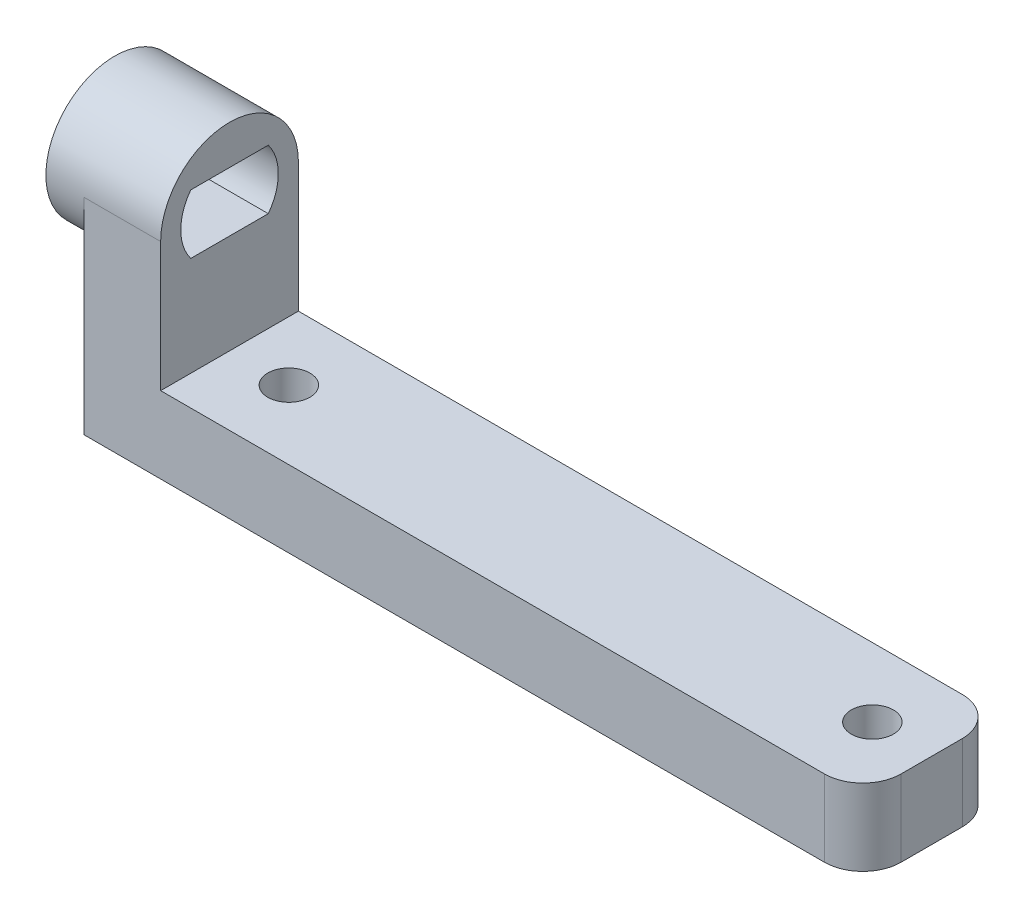
ISO-10303-21;
HEADER;
FILE_DESCRIPTION(('STEP AP214'),'2;1');
FILE_NAME('part.step','',(''),(''),'','','');
FILE_SCHEMA(('AUTOMOTIVE_DESIGN { 1 0 10303 214 1 1 1 1 }'));
ENDSEC;
DATA;
#1=APPLICATION_CONTEXT('core data for automotive mechanical design processes');
#2=APPLICATION_PROTOCOL_DEFINITION('international standard','automotive_design',2000,#1);
#3=PRODUCT_CONTEXT('',#1,'mechanical');
#4=PRODUCT('Part','Part','',(#3));
#5=PRODUCT_RELATED_PRODUCT_CATEGORY('part','',(#4));
#6=PRODUCT_DEFINITION_FORMATION('','',#4);
#7=PRODUCT_DEFINITION_CONTEXT('part definition',#1,'design');
#8=PRODUCT_DEFINITION('design','',#6,#7);
#9=PRODUCT_DEFINITION_SHAPE('','',#8);
#10=(LENGTH_UNIT() NAMED_UNIT(*) SI_UNIT(.MILLI.,.METRE.));
#11=(NAMED_UNIT(*) PLANE_ANGLE_UNIT() SI_UNIT($,.RADIAN.));
#12=(NAMED_UNIT(*) SI_UNIT($,.STERADIAN.) SOLID_ANGLE_UNIT());
#13=UNCERTAINTY_MEASURE_WITH_UNIT(LENGTH_MEASURE(1.E-05),#10,'distance_accuracy_value','');
#14=(GEOMETRIC_REPRESENTATION_CONTEXT(3) GLOBAL_UNCERTAINTY_ASSIGNED_CONTEXT((#13)) GLOBAL_UNIT_ASSIGNED_CONTEXT((#10,
#11,#12)) REPRESENTATION_CONTEXT('',''));
#15=CARTESIAN_POINT('',(0.,0.,0.));
#16=DIRECTION('',(0.,0.,1.));
#17=DIRECTION('',(1.,0.,0.));
#18=AXIS2_PLACEMENT_3D('',#15,#16,#17);
#19=CARTESIAN_POINT('',(0.,4.,3.6));
#20=DIRECTION('',(0.,0.,1.));
#21=DIRECTION('',(1.,0.,0.));
#22=AXIS2_PLACEMENT_3D('',#19,#20,#21);
#23=PLANE('',#22);
#24=DIRECTION('',(-1.,0.,0.));
#25=VECTOR('',#24,1.);
#26=CARTESIAN_POINT('',(0.,0.,3.6));
#27=LINE('',#26,#25);
#28=CARTESIAN_POINT('',(16.35,0.,3.6));
#29=VERTEX_POINT('',#28);
#30=CARTESIAN_POINT('',(-22.35,0.,3.6));
#31=VERTEX_POINT('',#30);
#32=EDGE_CURVE('E212',#29,#31,#27,.T.);
#33=ORIENTED_EDGE('',*,*,#32,.F.);
#34=DIRECTION('',(0.,-1.,0.));
#35=VECTOR('',#34,1.);
#36=CARTESIAN_POINT('',(16.35,4.,3.6));
#37=LINE('',#36,#35);
#38=CARTESIAN_POINT('',(16.35,4.,3.6));
#39=VERTEX_POINT('',#38);
#40=EDGE_CURVE('E11',#29,#39,#37,.F.);
#41=ORIENTED_EDGE('',*,*,#40,.T.);
#42=DIRECTION('',(-1.,0.,0.));
#43=VECTOR('',#42,1.);
#44=CARTESIAN_POINT('',(0.,4.,3.6));
#45=LINE('',#44,#43);
#46=CARTESIAN_POINT('',(-18.35,4.,3.6));
#47=VERTEX_POINT('',#46);
#48=EDGE_CURVE('E196',#39,#47,#45,.T.);
#49=ORIENTED_EDGE('',*,*,#48,.T.);
#50=DIRECTION('',(0.,-1.,0.));
#51=VECTOR('',#50,1.);
#52=CARTESIAN_POINT('',(-18.35,10.75,3.6));
#53=LINE('',#52,#51);
#54=CARTESIAN_POINT('',(-18.35,10.75,3.6));
#55=VERTEX_POINT('',#54);
#56=EDGE_CURVE('E174',#55,#47,#53,.T.);
#57=ORIENTED_EDGE('',*,*,#56,.F.);
#58=DIRECTION('',(-1.,0.,0.));
#59=VECTOR('',#58,1.);
#60=CARTESIAN_POINT('',(-18.35,10.75,3.6));
#61=LINE('',#60,#59);
#62=CARTESIAN_POINT('',(-22.35,10.75,3.6));
#63=VERTEX_POINT('',#62);
#64=EDGE_CURVE('E168',#55,#63,#61,.T.);
#65=ORIENTED_EDGE('',*,*,#64,.T.);
#66=DIRECTION('',(0.,-1.,0.));
#67=VECTOR('',#66,1.);
#68=CARTESIAN_POINT('',(-22.35,10.75,3.6));
#69=LINE('',#68,#67);
#70=EDGE_CURVE('E184',#63,#31,#69,.T.);
#71=ORIENTED_EDGE('',*,*,#70,.T.);
#72=EDGE_LOOP('',(#33,#41,#49,#57,#65,#71));
#73=FACE_BOUND('',#72,.T.);
#74=ADVANCED_FACE('F35',(#73),#23,.T.);
#75=CARTESIAN_POINT('',(18.35,4.,0.));
#76=DIRECTION('',(-1.,0.,0.));
#77=DIRECTION('',(0.,0.,1.));
#78=AXIS2_PLACEMENT_3D('',#75,#76,#77);
#79=PLANE('',#78);
#80=DIRECTION('',(0.,0.,-1.));
#81=VECTOR('',#80,1.);
#82=CARTESIAN_POINT('',(18.35,0.,0.));
#83=LINE('',#82,#81);
#84=CARTESIAN_POINT('',(18.35,0.,1.6));
#85=VERTEX_POINT('',#84);
#86=CARTESIAN_POINT('',(18.35,0.,-1.6));
#87=VERTEX_POINT('',#86);
#88=EDGE_CURVE('E214',#85,#87,#83,.T.);
#89=ORIENTED_EDGE('',*,*,#88,.T.);
#90=DIRECTION('',(0.,-1.,0.));
#91=VECTOR('',#90,1.);
#92=CARTESIAN_POINT('',(18.35,4.,-1.6));
#93=LINE('',#92,#91);
#94=CARTESIAN_POINT('',(18.35,4.,-1.6));
#95=VERTEX_POINT('',#94);
#96=EDGE_CURVE('E227',#87,#95,#93,.F.);
#97=ORIENTED_EDGE('',*,*,#96,.T.);
#98=DIRECTION('',(0.,0.,-1.));
#99=VECTOR('',#98,1.);
#100=CARTESIAN_POINT('',(18.35,4.,0.));
#101=LINE('',#100,#99);
#102=CARTESIAN_POINT('',(18.35,4.,1.6));
#103=VERTEX_POINT('',#102);
#104=EDGE_CURVE('E198',#103,#95,#101,.T.);
#105=ORIENTED_EDGE('',*,*,#104,.F.);
#106=DIRECTION('',(0.,-1.,0.));
#107=VECTOR('',#106,1.);
#108=CARTESIAN_POINT('',(18.35,0.,1.6));
#109=LINE('',#108,#107);
#110=EDGE_CURVE('E224',#103,#85,#109,.T.);
#111=ORIENTED_EDGE('',*,*,#110,.T.);
#112=EDGE_LOOP('',(#89,#97,#105,#111));
#113=FACE_BOUND('',#112,.T.);
#114=ADVANCED_FACE('F248',(#113),#79,.F.);
#115=CARTESIAN_POINT('',(0.,4.,-3.6));
#116=DIRECTION('',(0.,0.,1.));
#117=DIRECTION('',(1.,0.,0.));
#118=AXIS2_PLACEMENT_3D('',#115,#116,#117);
#119=PLANE('',#118);
#120=DIRECTION('',(-1.,0.,0.));
#121=VECTOR('',#120,1.);
#122=CARTESIAN_POINT('',(0.,4.,-3.6));
#123=LINE('',#122,#121);
#124=CARTESIAN_POINT('',(16.35,4.,-3.6));
#125=VERTEX_POINT('',#124);
#126=CARTESIAN_POINT('',(-18.35,4.,-3.6));
#127=VERTEX_POINT('',#126);
#128=EDGE_CURVE('E201',#125,#127,#123,.T.);
#129=ORIENTED_EDGE('',*,*,#128,.F.);
#130=DIRECTION('',(0.,-1.,0.));
#131=VECTOR('',#130,1.);
#132=CARTESIAN_POINT('',(16.35,4.,-3.6));
#133=LINE('',#132,#131);
#134=CARTESIAN_POINT('',(16.35,0.,-3.6));
#135=VERTEX_POINT('',#134);
#136=EDGE_CURVE('E206',#125,#135,#133,.T.);
#137=ORIENTED_EDGE('',*,*,#136,.T.);
#138=DIRECTION('',(-1.,0.,0.));
#139=VECTOR('',#138,1.);
#140=CARTESIAN_POINT('',(0.,0.,-3.6));
#141=LINE('',#140,#139);
#142=CARTESIAN_POINT('',(-22.35,0.,-3.6));
#143=VERTEX_POINT('',#142);
#144=EDGE_CURVE('E193',#135,#143,#141,.T.);
#145=ORIENTED_EDGE('',*,*,#144,.T.);
#146=DIRECTION('',(0.,-1.,0.));
#147=VECTOR('',#146,1.);
#148=CARTESIAN_POINT('',(-22.35,10.75,-3.6));
#149=LINE('',#148,#147);
#150=CARTESIAN_POINT('',(-22.35,10.75,-3.6));
#151=VERTEX_POINT('',#150);
#152=EDGE_CURVE('E181',#151,#143,#149,.T.);
#153=ORIENTED_EDGE('',*,*,#152,.F.);
#154=DIRECTION('',(1.,0.,0.));
#155=VECTOR('',#154,1.);
#156=CARTESIAN_POINT('',(-18.35,10.75,-3.6));
#157=LINE('',#156,#155);
#158=CARTESIAN_POINT('',(-18.35,10.75,-3.6));
#159=VERTEX_POINT('',#158);
#160=EDGE_CURVE('E171',#151,#159,#157,.T.);
#161=ORIENTED_EDGE('',*,*,#160,.T.);
#162=DIRECTION('',(0.,-1.,0.));
#163=VECTOR('',#162,1.);
#164=CARTESIAN_POINT('',(-18.35,10.75,-3.6));
#165=LINE('',#164,#163);
#166=EDGE_CURVE('E177',#159,#127,#165,.T.);
#167=ORIENTED_EDGE('',*,*,#166,.T.);
#168=EDGE_LOOP('',(#129,#137,#145,#153,#161,#167));
#169=FACE_BOUND('',#168,.T.);
#170=ADVANCED_FACE('F240',(#169),#119,.F.);
#171=CARTESIAN_POINT('',(15.25,4.,0.));
#172=DIRECTION('',(0.,-1.,0.));
#173=DIRECTION('',(0.,0.,-1.));
#174=AXIS2_PLACEMENT_3D('',#171,#172,#173);
#175=CYLINDRICAL_SURFACE('',#174,1.1);
#176=CARTESIAN_POINT('',(15.25,4.,0.));
#177=DIRECTION('',(0.,1.,0.));
#178=DIRECTION('',(0.,0.,1.));
#179=AXIS2_PLACEMENT_3D('',#176,#177,#178);
#180=CIRCLE('',#179,1.1);
#181=CARTESIAN_POINT('',(15.25,4.,1.1));
#182=VERTEX_POINT('',#181);
#183=EDGE_CURVE('E192',#182,#182,#180,.T.);
#184=ORIENTED_EDGE('',*,*,#183,.T.);
#185=EDGE_LOOP('',(#184));
#186=FACE_BOUND('',#185,.T.);
#187=CARTESIAN_POINT('',(15.25,0.,0.));
#188=DIRECTION('',(0.,1.,0.));
#189=DIRECTION('',(0.,0.,1.));
#190=AXIS2_PLACEMENT_3D('',#187,#188,#189);
#191=CIRCLE('',#190,1.1);
#192=CARTESIAN_POINT('',(15.25,0.,1.1));
#193=VERTEX_POINT('',#192);
#194=EDGE_CURVE('E209',#193,#193,#191,.T.);
#195=ORIENTED_EDGE('',*,*,#194,.F.);
#196=EDGE_LOOP('',(#195));
#197=FACE_BOUND('',#196,.T.);
#198=ADVANCED_FACE('F284',(#186,#197),#175,.F.);
#199=CARTESIAN_POINT('',(-15.25,4.,0.));
#200=DIRECTION('',(0.,-1.,0.));
#201=DIRECTION('',(0.,0.,-1.));
#202=AXIS2_PLACEMENT_3D('',#199,#200,#201);
#203=CYLINDRICAL_SURFACE('',#202,1.1);
#204=CARTESIAN_POINT('',(-15.25,4.,0.));
#205=DIRECTION('',(0.,1.,0.));
#206=DIRECTION('',(0.,0.,1.));
#207=AXIS2_PLACEMENT_3D('',#204,#205,#206);
#208=CIRCLE('',#207,1.1);
#209=CARTESIAN_POINT('',(-15.25,4.,1.1));
#210=VERTEX_POINT('',#209);
#211=EDGE_CURVE('E189',#210,#210,#208,.T.);
#212=ORIENTED_EDGE('',*,*,#211,.T.);
#213=EDGE_LOOP('',(#212));
#214=FACE_BOUND('',#213,.T.);
#215=CARTESIAN_POINT('',(-15.25,0.,0.));
#216=DIRECTION('',(0.,1.,0.));
#217=DIRECTION('',(0.,0.,1.));
#218=AXIS2_PLACEMENT_3D('',#215,#216,#217);
#219=CIRCLE('',#218,1.1);
#220=CARTESIAN_POINT('',(-15.25,0.,1.1));
#221=VERTEX_POINT('',#220);
#222=EDGE_CURVE('E180',#221,#221,#219,.T.);
#223=ORIENTED_EDGE('',*,*,#222,.F.);
#224=EDGE_LOOP('',(#223));
#225=FACE_BOUND('',#224,.T.);
#226=ADVANCED_FACE('F287',(#214,#225),#203,.F.);
#227=CARTESIAN_POINT('',(0.,4.,0.));
#228=DIRECTION('',(0.,1.,0.));
#229=DIRECTION('',(0.,0.,1.));
#230=AXIS2_PLACEMENT_3D('',#227,#228,#229);
#231=PLANE('',#230);
#232=ORIENTED_EDGE('',*,*,#211,.F.);
#233=EDGE_LOOP('',(#232));
#234=FACE_BOUND('',#233,.T.);
#235=ORIENTED_EDGE('',*,*,#183,.F.);
#236=EDGE_LOOP('',(#235));
#237=FACE_BOUND('',#236,.T.);
#238=ORIENTED_EDGE('',*,*,#104,.T.);
#239=CARTESIAN_POINT('',(16.35,4.,-1.6));
#240=DIRECTION('',(0.,1.,0.));
#241=DIRECTION('',(0.,0.,1.));
#242=AXIS2_PLACEMENT_3D('',#239,#240,#241);
#243=CIRCLE('',#242,2.);
#244=EDGE_CURVE('E43',#95,#125,#243,.T.);
#245=ORIENTED_EDGE('',*,*,#244,.T.);
#246=ORIENTED_EDGE('',*,*,#128,.T.);
#247=DIRECTION('',(0.,0.,-1.));
#248=VECTOR('',#247,1.);
#249=CARTESIAN_POINT('',(-18.35,4.,0.));
#250=LINE('',#249,#248);
#251=EDGE_CURVE('E203',#47,#127,#250,.T.);
#252=ORIENTED_EDGE('',*,*,#251,.F.);
#253=ORIENTED_EDGE('',*,*,#48,.F.);
#254=CARTESIAN_POINT('',(16.35,4.,1.6));
#255=DIRECTION('',(0.,1.,0.));
#256=DIRECTION('',(0.,0.,1.));
#257=AXIS2_PLACEMENT_3D('',#254,#255,#256);
#258=CIRCLE('',#257,2.);
#259=EDGE_CURVE('E229',#39,#103,#258,.T.);
#260=ORIENTED_EDGE('',*,*,#259,.T.);
#261=EDGE_LOOP('',(#238,#245,#246,#252,#253,#260));
#262=FACE_BOUND('',#261,.T.);
#263=ADVANCED_FACE('F233',(#234,#237,#262),#231,.T.);
#264=CARTESIAN_POINT('',(0.,0.,0.));
#265=DIRECTION('',(0.,1.,0.));
#266=DIRECTION('',(0.,0.,1.));
#267=AXIS2_PLACEMENT_3D('',#264,#265,#266);
#268=PLANE('',#267);
#269=ORIENTED_EDGE('',*,*,#222,.T.);
#270=EDGE_LOOP('',(#269));
#271=FACE_BOUND('',#270,.T.);
#272=ORIENTED_EDGE('',*,*,#194,.T.);
#273=EDGE_LOOP('',(#272));
#274=FACE_BOUND('',#273,.T.);
#275=ORIENTED_EDGE('',*,*,#144,.F.);
#276=CARTESIAN_POINT('',(16.35,0.,-1.6));
#277=DIRECTION('',(0.,1.,0.));
#278=DIRECTION('',(0.,0.,1.));
#279=AXIS2_PLACEMENT_3D('',#276,#277,#278);
#280=CIRCLE('',#279,2.);
#281=EDGE_CURVE('E222',#135,#87,#280,.F.);
#282=ORIENTED_EDGE('',*,*,#281,.T.);
#283=ORIENTED_EDGE('',*,*,#88,.F.);
#284=CARTESIAN_POINT('',(16.35,0.,1.6));
#285=DIRECTION('',(0.,1.,0.));
#286=DIRECTION('',(0.,0.,1.));
#287=AXIS2_PLACEMENT_3D('',#284,#285,#286);
#288=CIRCLE('',#287,2.);
#289=EDGE_CURVE('E220',#85,#29,#288,.F.);
#290=ORIENTED_EDGE('',*,*,#289,.T.);
#291=ORIENTED_EDGE('',*,*,#32,.T.);
#292=DIRECTION('',(0.,0.,-1.));
#293=VECTOR('',#292,1.);
#294=CARTESIAN_POINT('',(-22.35,0.,3.6));
#295=LINE('',#294,#293);
#296=EDGE_CURVE('E167',#31,#143,#295,.T.);
#297=ORIENTED_EDGE('',*,*,#296,.T.);
#298=EDGE_LOOP('',(#275,#282,#283,#290,#291,#297));
#299=FACE_BOUND('',#298,.T.);
#300=ADVANCED_FACE('F246',(#271,#274,#299),#268,.F.);
#301=CARTESIAN_POINT('',(-18.35,10.75,3.6));
#302=DIRECTION('',(1.,0.,0.));
#303=DIRECTION('',(0.,0.,-1.));
#304=AXIS2_PLACEMENT_3D('',#301,#302,#303);
#305=PLANE('',#304);
#306=CARTESIAN_POINT('',(-18.35,10.75,0.));
#307=DIRECTION('',(1.,0.,0.));
#308=DIRECTION('',(0.,0.,-1.));
#309=AXIS2_PLACEMENT_3D('',#306,#307,#308);
#310=CIRCLE('',#309,2.55);
#311=CARTESIAN_POINT('',(-18.35,12.3,-2.02484567313166));
#312=VERTEX_POINT('',#311);
#313=CARTESIAN_POINT('',(-18.35,9.2,-2.02484567313166));
#314=VERTEX_POINT('',#313);
#315=EDGE_CURVE('E138',#312,#314,#310,.F.);
#316=ORIENTED_EDGE('',*,*,#315,.T.);
#317=DIRECTION('',(0.,0.,-1.));
#318=VECTOR('',#317,1.);
#319=CARTESIAN_POINT('',(-18.35,9.2,0.));
#320=LINE('',#319,#318);
#321=CARTESIAN_POINT('',(-18.35,9.2,2.02484567313166));
#322=VERTEX_POINT('',#321);
#323=EDGE_CURVE('E124',#322,#314,#320,.T.);
#324=ORIENTED_EDGE('',*,*,#323,.F.);
#325=CARTESIAN_POINT('',(-18.35,10.75,0.));
#326=DIRECTION('',(1.,0.,0.));
#327=DIRECTION('',(0.,0.,-1.));
#328=AXIS2_PLACEMENT_3D('',#325,#326,#327);
#329=CIRCLE('',#328,2.55);
#330=CARTESIAN_POINT('',(-18.35,12.3,2.02484567313166));
#331=VERTEX_POINT('',#330);
#332=EDGE_CURVE('E154',#322,#331,#329,.F.);
#333=ORIENTED_EDGE('',*,*,#332,.T.);
#334=DIRECTION('',(0.,0.,-1.));
#335=VECTOR('',#334,1.);
#336=CARTESIAN_POINT('',(-18.35,12.3,0.));
#337=LINE('',#336,#335);
#338=EDGE_CURVE('E146',#331,#312,#337,.T.);
#339=ORIENTED_EDGE('',*,*,#338,.T.);
#340=EDGE_LOOP('',(#316,#324,#333,#339));
#341=FACE_BOUND('',#340,.T.);
#342=ORIENTED_EDGE('',*,*,#166,.F.);
#343=CARTESIAN_POINT('',(-18.35,10.75,0.));
#344=DIRECTION('',(1.,0.,0.));
#345=DIRECTION('',(0.,0.,-1.));
#346=AXIS2_PLACEMENT_3D('',#343,#344,#345);
#347=CIRCLE('',#346,3.6);
#348=EDGE_CURVE('E160',#159,#55,#347,.T.);
#349=ORIENTED_EDGE('',*,*,#348,.T.);
#350=ORIENTED_EDGE('',*,*,#56,.T.);
#351=ORIENTED_EDGE('',*,*,#251,.T.);
#352=EDGE_LOOP('',(#342,#349,#350,#351));
#353=FACE_BOUND('',#352,.T.);
#354=ADVANCED_FACE('F144',(#341,#353),#305,.T.);
#355=CARTESIAN_POINT('',(-22.35,10.75,3.6));
#356=DIRECTION('',(-1.,0.,0.));
#357=DIRECTION('',(0.,0.,1.));
#358=AXIS2_PLACEMENT_3D('',#355,#356,#357);
#359=PLANE('',#358);
#360=CARTESIAN_POINT('',(-22.35,10.75,0.));
#361=DIRECTION('',(-1.,0.,0.));
#362=DIRECTION('',(0.,0.,1.));
#363=AXIS2_PLACEMENT_3D('',#360,#361,#362);
#364=CIRCLE('',#363,3.6);
#365=EDGE_CURVE('E164',#151,#63,#364,.T.);
#366=ORIENTED_EDGE('',*,*,#365,.F.);
#367=ORIENTED_EDGE('',*,*,#152,.T.);
#368=ORIENTED_EDGE('',*,*,#296,.F.);
#369=ORIENTED_EDGE('',*,*,#70,.F.);
#370=EDGE_LOOP('',(#366,#367,#368,#369));
#371=FACE_BOUND('',#370,.T.);
#372=ADVANCED_FACE('F262',(#371),#359,.T.);
#373=CARTESIAN_POINT('',(-24.35,10.75,0.));
#374=DIRECTION('',(1.,0.,0.));
#375=DIRECTION('',(0.,0.,-1.));
#376=AXIS2_PLACEMENT_3D('',#373,#374,#375);
#377=CYLINDRICAL_SURFACE('',#376,3.6);
#378=CARTESIAN_POINT('',(-24.35,10.75,0.));
#379=DIRECTION('',(1.,0.,0.));
#380=DIRECTION('',(0.,0.,-1.));
#381=AXIS2_PLACEMENT_3D('',#378,#379,#380);
#382=CIRCLE('',#381,3.6);
#383=CARTESIAN_POINT('',(-24.35,10.75,-3.6));
#384=VERTEX_POINT('',#383);
#385=EDGE_CURVE('E161',#384,#384,#382,.T.);
#386=ORIENTED_EDGE('',*,*,#385,.T.);
#387=EDGE_LOOP('',(#386));
#388=FACE_BOUND('',#387,.T.);
#389=ORIENTED_EDGE('',*,*,#365,.T.);
#390=ORIENTED_EDGE('',*,*,#64,.F.);
#391=ORIENTED_EDGE('',*,*,#348,.F.);
#392=ORIENTED_EDGE('',*,*,#160,.F.);
#393=EDGE_LOOP('',(#389,#390,#391,#392));
#394=FACE_BOUND('',#393,.T.);
#395=ADVANCED_FACE('F265',(#388,#394),#377,.T.);
#396=CARTESIAN_POINT('',(-24.35,10.75,0.));
#397=DIRECTION('',(1.,0.,0.));
#398=DIRECTION('',(0.,0.,-1.));
#399=AXIS2_PLACEMENT_3D('',#396,#397,#398);
#400=PLANE('',#399);
#401=DIRECTION('',(0.,0.,-1.));
#402=VECTOR('',#401,1.);
#403=CARTESIAN_POINT('',(-24.35,9.2,0.));
#404=LINE('',#403,#402);
#405=CARTESIAN_POINT('',(-24.35,9.2,2.02484567313166));
#406=VERTEX_POINT('',#405);
#407=CARTESIAN_POINT('',(-24.35,9.2,-2.02484567313166));
#408=VERTEX_POINT('',#407);
#409=EDGE_CURVE('E155',#406,#408,#404,.T.);
#410=ORIENTED_EDGE('',*,*,#409,.T.);
#411=CARTESIAN_POINT('',(-24.35,10.75,0.));
#412=DIRECTION('',(-1.,0.,0.));
#413=DIRECTION('',(0.,0.,1.));
#414=AXIS2_PLACEMENT_3D('',#411,#412,#413);
#415=CIRCLE('',#414,2.55);
#416=CARTESIAN_POINT('',(-24.35,12.3,-2.02484567313166));
#417=VERTEX_POINT('',#416);
#418=EDGE_CURVE('E141',#417,#408,#415,.T.);
#419=ORIENTED_EDGE('',*,*,#418,.F.);
#420=DIRECTION('',(0.,0.,-1.));
#421=VECTOR('',#420,1.);
#422=CARTESIAN_POINT('',(-24.35,12.3,0.));
#423=LINE('',#422,#421);
#424=CARTESIAN_POINT('',(-24.35,12.3,2.02484567313166));
#425=VERTEX_POINT('',#424);
#426=EDGE_CURVE('E134',#425,#417,#423,.T.);
#427=ORIENTED_EDGE('',*,*,#426,.F.);
#428=CARTESIAN_POINT('',(-24.35,10.75,0.));
#429=DIRECTION('',(-1.,0.,0.));
#430=DIRECTION('',(0.,0.,1.));
#431=AXIS2_PLACEMENT_3D('',#428,#429,#430);
#432=CIRCLE('',#431,2.55);
#433=EDGE_CURVE('E58',#406,#425,#432,.T.);
#434=ORIENTED_EDGE('',*,*,#433,.F.);
#435=EDGE_LOOP('',(#410,#419,#427,#434));
#436=FACE_BOUND('',#435,.T.);
#437=ORIENTED_EDGE('',*,*,#385,.F.);
#438=EDGE_LOOP('',(#437));
#439=FACE_BOUND('',#438,.T.);
#440=ADVANCED_FACE('F292',(#436,#439),#400,.F.);
#441=CARTESIAN_POINT('',(16.35,4.,-1.6));
#442=DIRECTION('',(0.,-1.,0.));
#443=DIRECTION('',(0.,0.,-1.));
#444=AXIS2_PLACEMENT_3D('',#441,#442,#443);
#445=CYLINDRICAL_SURFACE('',#444,2.);
#446=ORIENTED_EDGE('',*,*,#244,.F.);
#447=ORIENTED_EDGE('',*,*,#96,.F.);
#448=ORIENTED_EDGE('',*,*,#281,.F.);
#449=ORIENTED_EDGE('',*,*,#136,.F.);
#450=EDGE_LOOP('',(#446,#447,#448,#449));
#451=FACE_BOUND('',#450,.T.);
#452=ADVANCED_FACE('F243',(#451),#445,.T.);
#453=CARTESIAN_POINT('',(16.35,4.,1.6));
#454=DIRECTION('',(0.,1.,0.));
#455=DIRECTION('',(0.,0.,1.));
#456=AXIS2_PLACEMENT_3D('',#453,#454,#455);
#457=CYLINDRICAL_SURFACE('',#456,2.);
#458=ORIENTED_EDGE('',*,*,#259,.F.);
#459=ORIENTED_EDGE('',*,*,#40,.F.);
#460=ORIENTED_EDGE('',*,*,#289,.F.);
#461=ORIENTED_EDGE('',*,*,#110,.F.);
#462=EDGE_LOOP('',(#458,#459,#460,#461));
#463=FACE_BOUND('',#462,.T.);
#464=ADVANCED_FACE('F37',(#463),#457,.T.);
#465=CARTESIAN_POINT('',(-12.3817506754493,10.75,0.));
#466=DIRECTION('',(-1.,0.,0.));
#467=DIRECTION('',(0.,0.,1.));
#468=AXIS2_PLACEMENT_3D('',#465,#466,#467);
#469=CYLINDRICAL_SURFACE('',#468,2.55);
#470=DIRECTION('',(-1.,0.,0.));
#471=VECTOR('',#470,1.);
#472=CARTESIAN_POINT('',(-12.3817506754493,12.3,-2.02484567313166));
#473=LINE('',#472,#471);
#474=EDGE_CURVE('E50',#312,#417,#473,.T.);
#475=ORIENTED_EDGE('',*,*,#474,.T.);
#476=ORIENTED_EDGE('',*,*,#418,.T.);
#477=DIRECTION('',(-1.,0.,0.));
#478=VECTOR('',#477,1.);
#479=CARTESIAN_POINT('',(-12.3817506754493,9.2,-2.02484567313166));
#480=LINE('',#479,#478);
#481=EDGE_CURVE('E128',#314,#408,#480,.T.);
#482=ORIENTED_EDGE('',*,*,#481,.F.);
#483=ORIENTED_EDGE('',*,*,#315,.F.);
#484=EDGE_LOOP('',(#475,#476,#482,#483));
#485=FACE_BOUND('',#484,.T.);
#486=ADVANCED_FACE('F137',(#485),#469,.F.);
#487=CARTESIAN_POINT('',(-12.3817506754493,9.2,0.));
#488=DIRECTION('',(0.,1.,0.));
#489=DIRECTION('',(0.,0.,1.));
#490=AXIS2_PLACEMENT_3D('',#487,#488,#489);
#491=PLANE('',#490);
#492=ORIENTED_EDGE('',*,*,#323,.T.);
#493=ORIENTED_EDGE('',*,*,#481,.T.);
#494=ORIENTED_EDGE('',*,*,#409,.F.);
#495=DIRECTION('',(-1.,0.,0.));
#496=VECTOR('',#495,1.);
#497=CARTESIAN_POINT('',(-12.3817506754493,9.2,2.02484567313166));
#498=LINE('',#497,#496);
#499=EDGE_CURVE('E130',#322,#406,#498,.T.);
#500=ORIENTED_EDGE('',*,*,#499,.F.);
#501=EDGE_LOOP('',(#492,#493,#494,#500));
#502=FACE_BOUND('',#501,.T.);
#503=ADVANCED_FACE('F126',(#502),#491,.T.);
#504=CARTESIAN_POINT('',(-12.3817506754493,10.75,0.));
#505=DIRECTION('',(-1.,0.,0.));
#506=DIRECTION('',(0.,0.,1.));
#507=AXIS2_PLACEMENT_3D('',#504,#505,#506);
#508=CYLINDRICAL_SURFACE('',#507,2.55);
#509=ORIENTED_EDGE('',*,*,#499,.T.);
#510=ORIENTED_EDGE('',*,*,#433,.T.);
#511=DIRECTION('',(-1.,0.,0.));
#512=VECTOR('',#511,1.);
#513=CARTESIAN_POINT('',(-12.3817506754493,12.3,2.02484567313166));
#514=LINE('',#513,#512);
#515=EDGE_CURVE('E153',#331,#425,#514,.T.);
#516=ORIENTED_EDGE('',*,*,#515,.F.);
#517=ORIENTED_EDGE('',*,*,#332,.F.);
#518=EDGE_LOOP('',(#509,#510,#516,#517));
#519=FACE_BOUND('',#518,.T.);
#520=ADVANCED_FACE('F310',(#519),#508,.F.);
#521=CARTESIAN_POINT('',(-12.3817506754493,12.3,0.));
#522=DIRECTION('',(0.,1.,0.));
#523=DIRECTION('',(0.,0.,1.));
#524=AXIS2_PLACEMENT_3D('',#521,#522,#523);
#525=PLANE('',#524);
#526=ORIENTED_EDGE('',*,*,#515,.T.);
#527=ORIENTED_EDGE('',*,*,#426,.T.);
#528=ORIENTED_EDGE('',*,*,#474,.F.);
#529=ORIENTED_EDGE('',*,*,#338,.F.);
#530=EDGE_LOOP('',(#526,#527,#528,#529));
#531=FACE_BOUND('',#530,.T.);
#532=ADVANCED_FACE('F313',(#531),#525,.F.);
#533=CLOSED_SHELL('',(#74,#114,#170,#198,#226,#263,#300,#354,#372,#395,#440,#452,#464,#486,#503,
#520,#532));
#534=MANIFOLD_SOLID_BREP('B2',#533);
#535=ADVANCED_BREP_SHAPE_REPRESENTATION('',(#18,#534),#14);
#536=SHAPE_DEFINITION_REPRESENTATION(#9,#535);
ENDSEC;
END-ISO-10303-21;
